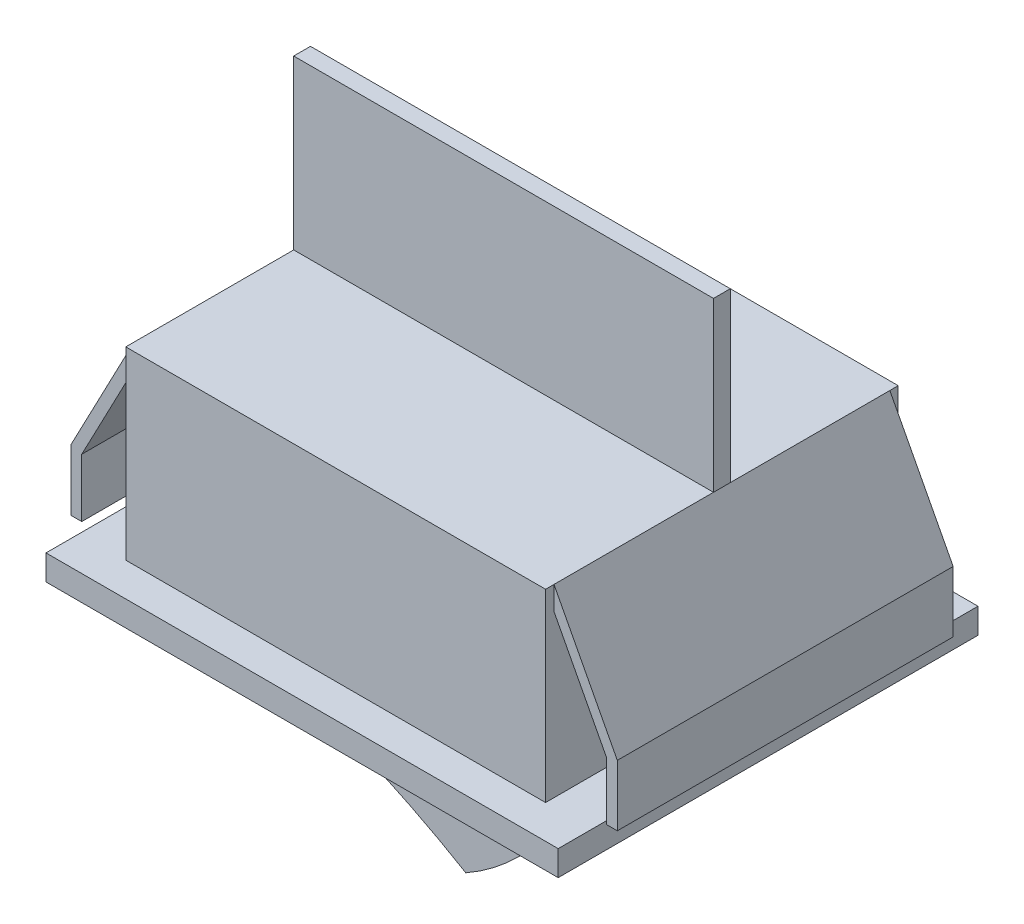
ISO-10303-21;
HEADER;
FILE_DESCRIPTION(('STEP AP214'),'2;1');
FILE_NAME('part.step','',(''),(''),'','','');
FILE_SCHEMA(('AUTOMOTIVE_DESIGN { 1 0 10303 214 1 1 1 1 }'));
ENDSEC;
DATA;
#1=APPLICATION_CONTEXT('core data for automotive mechanical design processes');
#2=APPLICATION_PROTOCOL_DEFINITION('international standard','automotive_design',2000,#1);
#3=PRODUCT_CONTEXT('',#1,'mechanical');
#4=PRODUCT('Part','Part','',(#3));
#5=PRODUCT_RELATED_PRODUCT_CATEGORY('part','',(#4));
#6=PRODUCT_DEFINITION_FORMATION('','',#4);
#7=PRODUCT_DEFINITION_CONTEXT('part definition',#1,'design');
#8=PRODUCT_DEFINITION('design','',#6,#7);
#9=PRODUCT_DEFINITION_SHAPE('','',#8);
#10=(LENGTH_UNIT() NAMED_UNIT(*) SI_UNIT(.MILLI.,.METRE.));
#11=(NAMED_UNIT(*) PLANE_ANGLE_UNIT() SI_UNIT($,.RADIAN.));
#12=(NAMED_UNIT(*) SI_UNIT($,.STERADIAN.) SOLID_ANGLE_UNIT());
#13=UNCERTAINTY_MEASURE_WITH_UNIT(LENGTH_MEASURE(1.E-05),#10,'distance_accuracy_value','');
#14=(GEOMETRIC_REPRESENTATION_CONTEXT(3) GLOBAL_UNCERTAINTY_ASSIGNED_CONTEXT((#13)) GLOBAL_UNIT_ASSIGNED_CONTEXT((#10,
#11,#12)) REPRESENTATION_CONTEXT('',''));
#15=CARTESIAN_POINT('',(0.,0.,0.));
#16=DIRECTION('',(0.,0.,1.));
#17=DIRECTION('',(1.,0.,0.));
#18=AXIS2_PLACEMENT_3D('',#15,#16,#17);
#19=CARTESIAN_POINT('',(12.5,11.,-10.5));
#20=DIRECTION('',(-1.,0.,0.));
#21=DIRECTION('',(0.,0.,1.));
#22=AXIS2_PLACEMENT_3D('',#19,#20,#21);
#23=PLANE('',#22);
#24=DIRECTION('',(0.,0.,1.));
#25=VECTOR('',#24,1.);
#26=CARTESIAN_POINT('',(12.5,11.,-10.));
#27=LINE('',#26,#25);
#28=CARTESIAN_POINT('',(12.5,11.,-0.500000000000004));
#29=VERTEX_POINT('',#28);
#30=CARTESIAN_POINT('',(12.5,11.,0.5));
#31=VERTEX_POINT('',#30);
#32=EDGE_CURVE('E11',#29,#31,#27,.T.);
#33=ORIENTED_EDGE('',*,*,#32,.F.);
#34=DIRECTION('',(0.,-1.,0.));
#35=VECTOR('',#34,1.);
#36=CARTESIAN_POINT('',(12.5,21.,-0.5));
#37=LINE('',#36,#35);
#38=CARTESIAN_POINT('',(12.5,21.,-0.5));
#39=VERTEX_POINT('',#38);
#40=EDGE_CURVE('E384',#39,#29,#37,.T.);
#41=ORIENTED_EDGE('',*,*,#40,.F.);
#42=DIRECTION('',(0.,0.,-1.));
#43=VECTOR('',#42,1.);
#44=CARTESIAN_POINT('',(12.5,21.,-0.5));
#45=LINE('',#44,#43);
#46=CARTESIAN_POINT('',(12.5,21.,0.5));
#47=VERTEX_POINT('',#46);
#48=EDGE_CURVE('E373',#47,#39,#45,.T.);
#49=ORIENTED_EDGE('',*,*,#48,.F.);
#50=DIRECTION('',(0.,-1.,0.));
#51=VECTOR('',#50,1.);
#52=CARTESIAN_POINT('',(12.5,21.,0.5));
#53=LINE('',#52,#51);
#54=EDGE_CURVE('E387',#47,#31,#53,.T.);
#55=ORIENTED_EDGE('',*,*,#54,.T.);
#56=EDGE_LOOP('',(#33,#41,#49,#55));
#57=FACE_BOUND('',#56,.T.);
#58=ADVANCED_FACE('F43',(#57),#23,.F.);
#59=CARTESIAN_POINT('',(-12.5,11.,-10.5));
#60=DIRECTION('',(1.,0.,0.));
#61=DIRECTION('',(0.,0.,-1.));
#62=AXIS2_PLACEMENT_3D('',#59,#60,#61);
#63=PLANE('',#62);
#64=DIRECTION('',(0.,1.,0.));
#65=VECTOR('',#64,1.);
#66=CARTESIAN_POINT('',(-12.5,9.6009161824891,10.));
#67=LINE('',#66,#65);
#68=CARTESIAN_POINT('',(-12.5,9.6009161824891,10.));
#69=VERTEX_POINT('',#68);
#70=CARTESIAN_POINT('',(-12.5,11.,10.));
#71=VERTEX_POINT('',#70);
#72=EDGE_CURVE('E310',#69,#71,#67,.T.);
#73=ORIENTED_EDGE('',*,*,#72,.F.);
#74=DIRECTION('',(0.,0.,1.));
#75=VECTOR('',#74,1.);
#76=CARTESIAN_POINT('',(-12.5,9.6009161824891,-10.));
#77=LINE('',#76,#75);
#78=CARTESIAN_POINT('',(-12.5,9.6009161824891,-10.));
#79=VERTEX_POINT('',#78);
#80=EDGE_CURVE('E354',#79,#69,#77,.T.);
#81=ORIENTED_EDGE('',*,*,#80,.F.);
#82=DIRECTION('',(0.,1.,0.));
#83=VECTOR('',#82,1.);
#84=CARTESIAN_POINT('',(-12.5,9.6009161824891,-10.));
#85=LINE('',#84,#83);
#86=CARTESIAN_POINT('',(-12.5,11.,-10.));
#87=VERTEX_POINT('',#86);
#88=EDGE_CURVE('E335',#79,#87,#85,.T.);
#89=ORIENTED_EDGE('',*,*,#88,.T.);
#90=DIRECTION('',(0.,0.,1.));
#91=VECTOR('',#90,1.);
#92=CARTESIAN_POINT('',(-12.5,11.,-10.5));
#93=LINE('',#92,#91);
#94=CARTESIAN_POINT('',(-12.5,11.,-10.5));
#95=VERTEX_POINT('',#94);
#96=EDGE_CURVE('E394',#95,#87,#93,.T.);
#97=ORIENTED_EDGE('',*,*,#96,.F.);
#98=DIRECTION('',(0.,-1.,0.));
#99=VECTOR('',#98,1.);
#100=CARTESIAN_POINT('',(-12.5,11.,-10.5));
#101=LINE('',#100,#99);
#102=CARTESIAN_POINT('',(-12.5,0.,-10.5));
#103=VERTEX_POINT('',#102);
#104=EDGE_CURVE('E409',#95,#103,#101,.T.);
#105=ORIENTED_EDGE('',*,*,#104,.T.);
#106=DIRECTION('',(0.,0.,1.));
#107=VECTOR('',#106,1.);
#108=CARTESIAN_POINT('',(-12.5,0.,-10.5));
#109=LINE('',#108,#107);
#110=CARTESIAN_POINT('',(-12.5,0.,10.5));
#111=VERTEX_POINT('',#110);
#112=EDGE_CURVE('E393',#103,#111,#109,.T.);
#113=ORIENTED_EDGE('',*,*,#112,.T.);
#114=DIRECTION('',(0.,-1.,0.));
#115=VECTOR('',#114,1.);
#116=CARTESIAN_POINT('',(-12.5,11.,10.5));
#117=LINE('',#116,#115);
#118=CARTESIAN_POINT('',(-12.5,11.,10.5));
#119=VERTEX_POINT('',#118);
#120=EDGE_CURVE('E47',#119,#111,#117,.T.);
#121=ORIENTED_EDGE('',*,*,#120,.F.);
#122=EDGE_CURVE('E399',#71,#119,#93,.T.);
#123=ORIENTED_EDGE('',*,*,#122,.F.);
#124=EDGE_LOOP('',(#73,#81,#89,#97,#105,#113,#121,#123));
#125=FACE_BOUND('',#124,.T.);
#126=ADVANCED_FACE('F465',(#125),#63,.F.);
#127=CARTESIAN_POINT('',(0.,11.,0.));
#128=DIRECTION('',(0.,-1.,0.));
#129=DIRECTION('',(0.,0.,-1.));
#130=AXIS2_PLACEMENT_3D('',#127,#128,#129);
#131=PLANE('',#130);
#132=DIRECTION('',(-1.,0.,0.));
#133=VECTOR('',#132,1.);
#134=CARTESIAN_POINT('',(12.5,11.,-0.5));
#135=LINE('',#134,#133);
#136=CARTESIAN_POINT('',(-12.5,11.,-0.5));
#137=VERTEX_POINT('',#136);
#138=EDGE_CURVE('E371',#29,#137,#135,.T.);
#139=ORIENTED_EDGE('',*,*,#138,.F.);
#140=DIRECTION('',(0.,0.,-1.));
#141=VECTOR('',#140,1.);
#142=CARTESIAN_POINT('',(12.5,11.,-10.5));
#143=LINE('',#142,#141);
#144=CARTESIAN_POINT('',(12.5,11.,-10.));
#145=VERTEX_POINT('',#144);
#146=EDGE_CURVE('E407',#29,#145,#143,.T.);
#147=ORIENTED_EDGE('',*,*,#146,.T.);
#148=CARTESIAN_POINT('',(12.5,11.,-10.5));
#149=VERTEX_POINT('',#148);
#150=EDGE_CURVE('E401',#145,#149,#143,.T.);
#151=ORIENTED_EDGE('',*,*,#150,.T.);
#152=DIRECTION('',(-1.,0.,0.));
#153=VECTOR('',#152,1.);
#154=CARTESIAN_POINT('',(12.5,11.,-10.5));
#155=LINE('',#154,#153);
#156=EDGE_CURVE('E405',#149,#95,#155,.T.);
#157=ORIENTED_EDGE('',*,*,#156,.T.);
#158=ORIENTED_EDGE('',*,*,#96,.T.);
#159=DIRECTION('',(0.,0.,1.));
#160=VECTOR('',#159,1.);
#161=CARTESIAN_POINT('',(-12.5,11.,-10.));
#162=LINE('',#161,#160);
#163=EDGE_CURVE('E353',#87,#137,#162,.T.);
#164=ORIENTED_EDGE('',*,*,#163,.T.);
#165=EDGE_LOOP('',(#139,#147,#151,#157,#158,#164));
#166=FACE_BOUND('',#165,.T.);
#167=ADVANCED_FACE('F458',(#166),#131,.F.);
#168=DIRECTION('',(1.,0.,0.));
#169=VECTOR('',#168,1.);
#170=CARTESIAN_POINT('',(12.5,11.,0.5));
#171=LINE('',#170,#169);
#172=CARTESIAN_POINT('',(-12.5,11.,0.499999999999997));
#173=VERTEX_POINT('',#172);
#174=EDGE_CURVE('E356',#173,#31,#171,.T.);
#175=ORIENTED_EDGE('',*,*,#174,.F.);
#176=EDGE_CURVE('E398',#173,#71,#93,.T.);
#177=ORIENTED_EDGE('',*,*,#176,.T.);
#178=ORIENTED_EDGE('',*,*,#122,.T.);
#179=DIRECTION('',(1.,0.,0.));
#180=VECTOR('',#179,1.);
#181=CARTESIAN_POINT('',(12.5,11.,10.5));
#182=LINE('',#181,#180);
#183=CARTESIAN_POINT('',(12.5,11.,10.5));
#184=VERTEX_POINT('',#183);
#185=EDGE_CURVE('E397',#119,#184,#182,.T.);
#186=ORIENTED_EDGE('',*,*,#185,.T.);
#187=CARTESIAN_POINT('',(12.5,11.,9.99999999999999));
#188=VERTEX_POINT('',#187);
#189=EDGE_CURVE('E402',#184,#188,#143,.T.);
#190=ORIENTED_EDGE('',*,*,#189,.T.);
#191=EDGE_CURVE('E406',#188,#31,#143,.T.);
#192=ORIENTED_EDGE('',*,*,#191,.T.);
#193=EDGE_LOOP('',(#175,#177,#178,#186,#190,#192));
#194=FACE_BOUND('',#193,.T.);
#195=ADVANCED_FACE('F443',(#194),#131,.F.);
#196=DIRECTION('',(0.,-1.,0.));
#197=VECTOR('',#196,1.);
#198=CARTESIAN_POINT('',(-12.5,21.,-0.5));
#199=LINE('',#198,#197);
#200=CARTESIAN_POINT('',(-12.5,21.,-0.5));
#201=VERTEX_POINT('',#200);
#202=EDGE_CURVE('E377',#201,#137,#199,.T.);
#203=ORIENTED_EDGE('',*,*,#202,.T.);
#204=EDGE_CURVE('E52',#137,#173,#162,.T.);
#205=ORIENTED_EDGE('',*,*,#204,.T.);
#206=DIRECTION('',(0.,-1.,0.));
#207=VECTOR('',#206,1.);
#208=CARTESIAN_POINT('',(-12.5,21.,0.5));
#209=LINE('',#208,#207);
#210=CARTESIAN_POINT('',(-12.5,21.,0.5));
#211=VERTEX_POINT('',#210);
#212=EDGE_CURVE('E390',#211,#173,#209,.T.);
#213=ORIENTED_EDGE('',*,*,#212,.F.);
#214=DIRECTION('',(0.,0.,1.));
#215=VECTOR('',#214,1.);
#216=CARTESIAN_POINT('',(-12.5,21.,-0.5));
#217=LINE('',#216,#215);
#218=EDGE_CURVE('E367',#201,#211,#217,.T.);
#219=ORIENTED_EDGE('',*,*,#218,.F.);
#220=EDGE_LOOP('',(#203,#205,#213,#219));
#221=FACE_BOUND('',#220,.T.);
#222=ADVANCED_FACE('F45',(#221),#63,.F.);
#223=CARTESIAN_POINT('',(12.5,11.,10.5));
#224=DIRECTION('',(0.,0.,-1.));
#225=DIRECTION('',(-1.,0.,0.));
#226=AXIS2_PLACEMENT_3D('',#223,#224,#225);
#227=PLANE('',#226);
#228=DIRECTION('',(1.,0.,0.));
#229=VECTOR('',#228,1.);
#230=CARTESIAN_POINT('',(12.5,0.,10.5));
#231=LINE('',#230,#229);
#232=CARTESIAN_POINT('',(12.5,0.,10.5));
#233=VERTEX_POINT('',#232);
#234=EDGE_CURVE('E412',#111,#233,#231,.T.);
#235=ORIENTED_EDGE('',*,*,#234,.T.);
#236=DIRECTION('',(0.,-1.,0.));
#237=VECTOR('',#236,1.);
#238=CARTESIAN_POINT('',(12.5,11.,10.5));
#239=LINE('',#238,#237);
#240=EDGE_CURVE('E425',#184,#233,#239,.T.);
#241=ORIENTED_EDGE('',*,*,#240,.F.);
#242=ORIENTED_EDGE('',*,*,#185,.F.);
#243=ORIENTED_EDGE('',*,*,#120,.T.);
#244=EDGE_LOOP('',(#235,#241,#242,#243));
#245=FACE_BOUND('',#244,.T.);
#246=ADVANCED_FACE('F487',(#245),#227,.F.);
#247=DIRECTION('',(0.,0.,1.));
#248=VECTOR('',#247,1.);
#249=CARTESIAN_POINT('',(12.5,9.6009161824891,-10.));
#250=LINE('',#249,#248);
#251=CARTESIAN_POINT('',(12.5,9.6009161824891,-10.));
#252=VERTEX_POINT('',#251);
#253=CARTESIAN_POINT('',(12.5,9.6009161824891,10.));
#254=VERTEX_POINT('',#253);
#255=EDGE_CURVE('E68',#252,#254,#250,.T.);
#256=ORIENTED_EDGE('',*,*,#255,.T.);
#257=DIRECTION('',(0.,1.,0.));
#258=VECTOR('',#257,1.);
#259=CARTESIAN_POINT('',(12.5,9.6009161824891,10.));
#260=LINE('',#259,#258);
#261=EDGE_CURVE('E277',#254,#188,#260,.T.);
#262=ORIENTED_EDGE('',*,*,#261,.T.);
#263=ORIENTED_EDGE('',*,*,#189,.F.);
#264=ORIENTED_EDGE('',*,*,#240,.T.);
#265=DIRECTION('',(0.,0.,-1.));
#266=VECTOR('',#265,1.);
#267=CARTESIAN_POINT('',(12.5,0.,-10.5));
#268=LINE('',#267,#266);
#269=CARTESIAN_POINT('',(12.5,0.,-10.5));
#270=VERTEX_POINT('',#269);
#271=EDGE_CURVE('E415',#233,#270,#268,.T.);
#272=ORIENTED_EDGE('',*,*,#271,.T.);
#273=DIRECTION('',(0.,-1.,0.));
#274=VECTOR('',#273,1.);
#275=CARTESIAN_POINT('',(12.5,11.,-10.5));
#276=LINE('',#275,#274);
#277=EDGE_CURVE('E423',#149,#270,#276,.T.);
#278=ORIENTED_EDGE('',*,*,#277,.F.);
#279=ORIENTED_EDGE('',*,*,#150,.F.);
#280=DIRECTION('',(0.,1.,0.));
#281=VECTOR('',#280,1.);
#282=CARTESIAN_POINT('',(12.5,9.6009161824891,-10.));
#283=LINE('',#282,#281);
#284=EDGE_CURVE('E294',#252,#145,#283,.T.);
#285=ORIENTED_EDGE('',*,*,#284,.F.);
#286=EDGE_LOOP('',(#256,#262,#263,#264,#272,#278,#279,#285));
#287=FACE_BOUND('',#286,.T.);
#288=ADVANCED_FACE('F495',(#287),#23,.F.);
#289=CARTESIAN_POINT('',(12.5,11.,-10.5));
#290=DIRECTION('',(0.,0.,1.));
#291=DIRECTION('',(1.,0.,0.));
#292=AXIS2_PLACEMENT_3D('',#289,#290,#291);
#293=PLANE('',#292);
#294=DIRECTION('',(-1.,0.,0.));
#295=VECTOR('',#294,1.);
#296=CARTESIAN_POINT('',(12.5,0.,-10.5));
#297=LINE('',#296,#295);
#298=EDGE_CURVE('E418',#270,#103,#297,.T.);
#299=ORIENTED_EDGE('',*,*,#298,.T.);
#300=ORIENTED_EDGE('',*,*,#104,.F.);
#301=ORIENTED_EDGE('',*,*,#156,.F.);
#302=ORIENTED_EDGE('',*,*,#277,.T.);
#303=EDGE_LOOP('',(#299,#300,#301,#302));
#304=FACE_BOUND('',#303,.T.);
#305=ADVANCED_FACE('F492',(#304),#293,.F.);
#306=CARTESIAN_POINT('',(12.5,21.,0.5));
#307=DIRECTION('',(0.,0.,-1.));
#308=DIRECTION('',(-1.,0.,0.));
#309=AXIS2_PLACEMENT_3D('',#306,#307,#308);
#310=PLANE('',#309);
#311=ORIENTED_EDGE('',*,*,#174,.T.);
#312=ORIENTED_EDGE('',*,*,#54,.F.);
#313=DIRECTION('',(1.,0.,0.));
#314=VECTOR('',#313,1.);
#315=CARTESIAN_POINT('',(12.5,21.,0.5));
#316=LINE('',#315,#314);
#317=EDGE_CURVE('E370',#211,#47,#316,.T.);
#318=ORIENTED_EDGE('',*,*,#317,.F.);
#319=ORIENTED_EDGE('',*,*,#212,.T.);
#320=EDGE_LOOP('',(#311,#312,#318,#319));
#321=FACE_BOUND('',#320,.T.);
#322=ADVANCED_FACE('F447',(#321),#310,.F.);
#323=CARTESIAN_POINT('',(12.5,21.,-0.5));
#324=DIRECTION('',(0.,0.,1.));
#325=DIRECTION('',(1.,0.,0.));
#326=AXIS2_PLACEMENT_3D('',#323,#324,#325);
#327=PLANE('',#326);
#328=ORIENTED_EDGE('',*,*,#138,.T.);
#329=ORIENTED_EDGE('',*,*,#202,.F.);
#330=DIRECTION('',(-1.,0.,0.));
#331=VECTOR('',#330,1.);
#332=CARTESIAN_POINT('',(12.5,21.,-0.5));
#333=LINE('',#332,#331);
#334=EDGE_CURVE('E375',#39,#201,#333,.T.);
#335=ORIENTED_EDGE('',*,*,#334,.F.);
#336=ORIENTED_EDGE('',*,*,#40,.T.);
#337=EDGE_LOOP('',(#328,#329,#335,#336));
#338=FACE_BOUND('',#337,.T.);
#339=ADVANCED_FACE('F454',(#338),#327,.F.);
#340=CARTESIAN_POINT('',(0.,21.,0.));
#341=DIRECTION('',(0.,-1.,0.));
#342=DIRECTION('',(0.,0.,-1.));
#343=AXIS2_PLACEMENT_3D('',#340,#341,#342);
#344=PLANE('',#343);
#345=ORIENTED_EDGE('',*,*,#218,.T.);
#346=ORIENTED_EDGE('',*,*,#317,.T.);
#347=ORIENTED_EDGE('',*,*,#48,.T.);
#348=ORIENTED_EDGE('',*,*,#334,.T.);
#349=EDGE_LOOP('',(#345,#346,#347,#348));
#350=FACE_BOUND('',#349,.T.);
#351=ADVANCED_FACE('F450',(#350),#344,.F.);
#352=CARTESIAN_POINT('',(-15.6214209350957,3.65136710304997,-10.));
#353=DIRECTION('',(0.88552603850104,-0.464589749280648,0.));
#354=DIRECTION('',(0.464589749280648,0.88552603850104,0.));
#355=AXIS2_PLACEMENT_3D('',#352,#353,#354);
#356=PLANE('',#355);
#357=ORIENTED_EDGE('',*,*,#80,.T.);
#358=DIRECTION('',(0.464589749280648,0.88552603850104,0.));
#359=VECTOR('',#358,1.);
#360=CARTESIAN_POINT('',(-15.6214209350957,3.65136710304997,10.));
#361=LINE('',#360,#359);
#362=CARTESIAN_POINT('',(-15.6214209350957,3.65136710304997,10.));
#363=VERTEX_POINT('',#362);
#364=EDGE_CURVE('E332',#363,#69,#361,.T.);
#365=ORIENTED_EDGE('',*,*,#364,.F.);
#366=DIRECTION('',(0.,0.,1.));
#367=VECTOR('',#366,1.);
#368=CARTESIAN_POINT('',(-15.6214209350957,3.65136710304997,-10.));
#369=LINE('',#368,#367);
#370=CARTESIAN_POINT('',(-15.6214209350957,3.65136710304997,-10.));
#371=VERTEX_POINT('',#370);
#372=EDGE_CURVE('E357',#371,#363,#369,.T.);
#373=ORIENTED_EDGE('',*,*,#372,.F.);
#374=DIRECTION('',(0.464589749280648,0.88552603850104,0.));
#375=VECTOR('',#374,1.);
#376=CARTESIAN_POINT('',(-15.6214209350957,3.65136710304997,-10.));
#377=LINE('',#376,#375);
#378=EDGE_CURVE('E350',#371,#79,#377,.T.);
#379=ORIENTED_EDGE('',*,*,#378,.T.);
#380=EDGE_LOOP('',(#357,#365,#373,#379));
#381=FACE_BOUND('',#380,.T.);
#382=ADVANCED_FACE('F472',(#381),#356,.T.);
#383=CARTESIAN_POINT('',(-15.6214209350957,0.178717711958706,-10.));
#384=DIRECTION('',(1.,0.,0.));
#385=DIRECTION('',(0.,0.,-1.));
#386=AXIS2_PLACEMENT_3D('',#383,#384,#385);
#387=PLANE('',#386);
#388=ORIENTED_EDGE('',*,*,#372,.T.);
#389=DIRECTION('',(0.,1.,0.));
#390=VECTOR('',#389,1.);
#391=CARTESIAN_POINT('',(-15.6214209350957,0.178717711958706,10.));
#392=LINE('',#391,#390);
#393=CARTESIAN_POINT('',(-15.6214209350957,0.178717711958706,10.));
#394=VERTEX_POINT('',#393);
#395=EDGE_CURVE('E329',#394,#363,#392,.T.);
#396=ORIENTED_EDGE('',*,*,#395,.F.);
#397=DIRECTION('',(0.,0.,1.));
#398=VECTOR('',#397,1.);
#399=CARTESIAN_POINT('',(-15.6214209350957,0.178717711958706,-10.));
#400=LINE('',#399,#398);
#401=CARTESIAN_POINT('',(-15.6214209350957,0.178717711958706,-10.));
#402=VERTEX_POINT('',#401);
#403=EDGE_CURVE('E359',#402,#394,#400,.T.);
#404=ORIENTED_EDGE('',*,*,#403,.F.);
#405=DIRECTION('',(0.,1.,0.));
#406=VECTOR('',#405,1.);
#407=CARTESIAN_POINT('',(-15.6214209350957,0.178717711958706,-10.));
#408=LINE('',#407,#406);
#409=EDGE_CURVE('E347',#402,#371,#408,.T.);
#410=ORIENTED_EDGE('',*,*,#409,.T.);
#411=EDGE_LOOP('',(#388,#396,#404,#410));
#412=FACE_BOUND('',#411,.T.);
#413=ADVANCED_FACE('F476',(#412),#387,.T.);
#414=CARTESIAN_POINT('',(-16.2714209350957,0.178717711958706,-10.));
#415=DIRECTION('',(0.,-1.,0.));
#416=DIRECTION('',(0.,0.,-1.));
#417=AXIS2_PLACEMENT_3D('',#414,#415,#416);
#418=PLANE('',#417);
#419=ORIENTED_EDGE('',*,*,#403,.T.);
#420=DIRECTION('',(1.,0.,0.));
#421=VECTOR('',#420,1.);
#422=CARTESIAN_POINT('',(-16.2714209350957,0.178717711958706,10.));
#423=LINE('',#422,#421);
#424=CARTESIAN_POINT('',(-16.2714209350957,0.178717711958706,10.));
#425=VERTEX_POINT('',#424);
#426=EDGE_CURVE('E326',#425,#394,#423,.T.);
#427=ORIENTED_EDGE('',*,*,#426,.F.);
#428=DIRECTION('',(0.,0.,1.));
#429=VECTOR('',#428,1.);
#430=CARTESIAN_POINT('',(-16.2714209350957,0.178717711958706,-10.));
#431=LINE('',#430,#429);
#432=CARTESIAN_POINT('',(-16.2714209350957,0.178717711958706,-10.));
#433=VERTEX_POINT('',#432);
#434=EDGE_CURVE('E361',#433,#425,#431,.T.);
#435=ORIENTED_EDGE('',*,*,#434,.F.);
#436=DIRECTION('',(1.,0.,0.));
#437=VECTOR('',#436,1.);
#438=CARTESIAN_POINT('',(-16.2714209350957,0.178717711958706,-10.));
#439=LINE('',#438,#437);
#440=EDGE_CURVE('E344',#433,#402,#439,.T.);
#441=ORIENTED_EDGE('',*,*,#440,.T.);
#442=EDGE_LOOP('',(#419,#427,#435,#441));
#443=FACE_BOUND('',#442,.T.);
#444=ADVANCED_FACE('F479',(#443),#418,.T.);
#445=CARTESIAN_POINT('',(-16.2714209350957,3.81152577010953,-10.));
#446=DIRECTION('',(-1.,0.,0.));
#447=DIRECTION('',(0.,0.,1.));
#448=AXIS2_PLACEMENT_3D('',#445,#446,#447);
#449=PLANE('',#448);
#450=ORIENTED_EDGE('',*,*,#434,.T.);
#451=DIRECTION('',(0.,-1.,0.));
#452=VECTOR('',#451,1.);
#453=CARTESIAN_POINT('',(-16.2714209350957,3.81152577010953,10.));
#454=LINE('',#453,#452);
#455=CARTESIAN_POINT('',(-16.2714209350957,3.81152577010953,10.));
#456=VERTEX_POINT('',#455);
#457=EDGE_CURVE('E323',#456,#425,#454,.T.);
#458=ORIENTED_EDGE('',*,*,#457,.F.);
#459=DIRECTION('',(0.,0.,1.));
#460=VECTOR('',#459,1.);
#461=CARTESIAN_POINT('',(-16.2714209350957,3.81152577010953,-10.));
#462=LINE('',#461,#460);
#463=CARTESIAN_POINT('',(-16.2714209350957,3.81152577010953,-10.));
#464=VERTEX_POINT('',#463);
#465=EDGE_CURVE('E363',#464,#456,#462,.T.);
#466=ORIENTED_EDGE('',*,*,#465,.F.);
#467=DIRECTION('',(0.,-1.,0.));
#468=VECTOR('',#467,1.);
#469=CARTESIAN_POINT('',(-16.2714209350957,3.81152577010953,-10.));
#470=LINE('',#469,#468);
#471=EDGE_CURVE('E341',#464,#433,#470,.T.);
#472=ORIENTED_EDGE('',*,*,#471,.T.);
#473=EDGE_LOOP('',(#450,#458,#466,#472));
#474=FACE_BOUND('',#473,.T.);
#475=ADVANCED_FACE('F483',(#474),#449,.T.);
#476=CARTESIAN_POINT('',(-12.5,11.,-10.));
#477=DIRECTION('',(-0.88552603850104,0.464589749280648,0.));
#478=DIRECTION('',(-0.464589749280648,-0.88552603850104,0.));
#479=AXIS2_PLACEMENT_3D('',#476,#477,#478);
#480=PLANE('',#479);
#481=ORIENTED_EDGE('',*,*,#465,.T.);
#482=DIRECTION('',(-0.464589749280648,-0.88552603850104,0.));
#483=VECTOR('',#482,1.);
#484=CARTESIAN_POINT('',(-12.5,11.,10.));
#485=LINE('',#484,#483);
#486=EDGE_CURVE('E320',#71,#456,#485,.T.);
#487=ORIENTED_EDGE('',*,*,#486,.F.);
#488=ORIENTED_EDGE('',*,*,#176,.F.);
#489=ORIENTED_EDGE('',*,*,#204,.F.);
#490=ORIENTED_EDGE('',*,*,#163,.F.);
#491=DIRECTION('',(-0.464589749280648,-0.88552603850104,0.));
#492=VECTOR('',#491,1.);
#493=CARTESIAN_POINT('',(-12.5,11.,-10.));
#494=LINE('',#493,#492);
#495=EDGE_CURVE('E338',#87,#464,#494,.T.);
#496=ORIENTED_EDGE('',*,*,#495,.T.);
#497=EDGE_LOOP('',(#481,#487,#488,#489,#490,#496));
#498=FACE_BOUND('',#497,.T.);
#499=ADVANCED_FACE('F461',(#498),#480,.T.);
#500=CARTESIAN_POINT('',(0.,0.,-10.));
#501=DIRECTION('',(0.,0.,-1.));
#502=DIRECTION('',(-1.,0.,0.));
#503=AXIS2_PLACEMENT_3D('',#500,#501,#502);
#504=PLANE('',#503);
#505=ORIENTED_EDGE('',*,*,#88,.F.);
#506=ORIENTED_EDGE('',*,*,#378,.F.);
#507=ORIENTED_EDGE('',*,*,#409,.F.);
#508=ORIENTED_EDGE('',*,*,#440,.F.);
#509=ORIENTED_EDGE('',*,*,#471,.F.);
#510=ORIENTED_EDGE('',*,*,#495,.F.);
#511=EDGE_LOOP('',(#505,#506,#507,#508,#509,#510));
#512=FACE_BOUND('',#511,.T.);
#513=ADVANCED_FACE('F468',(#512),#504,.T.);
#514=CARTESIAN_POINT('',(0.,0.,10.));
#515=DIRECTION('',(0.,0.,-1.));
#516=DIRECTION('',(-1.,0.,0.));
#517=AXIS2_PLACEMENT_3D('',#514,#515,#516);
#518=PLANE('',#517);
#519=ORIENTED_EDGE('',*,*,#72,.T.);
#520=ORIENTED_EDGE('',*,*,#486,.T.);
#521=ORIENTED_EDGE('',*,*,#457,.T.);
#522=ORIENTED_EDGE('',*,*,#426,.T.);
#523=ORIENTED_EDGE('',*,*,#395,.T.);
#524=ORIENTED_EDGE('',*,*,#364,.T.);
#525=EDGE_LOOP('',(#519,#520,#521,#522,#523,#524));
#526=FACE_BOUND('',#525,.T.);
#527=ADVANCED_FACE('F485',(#526),#518,.F.);
#528=CARTESIAN_POINT('',(12.5,11.,-10.));
#529=DIRECTION('',(-0.88552603850104,-0.464589749280648,0.));
#530=DIRECTION('',(0.464589749280648,-0.88552603850104,0.));
#531=AXIS2_PLACEMENT_3D('',#528,#529,#530);
#532=PLANE('',#531);
#533=ORIENTED_EDGE('',*,*,#146,.F.);
#534=ORIENTED_EDGE('',*,*,#32,.T.);
#535=ORIENTED_EDGE('',*,*,#191,.F.);
#536=DIRECTION('',(0.464589749280648,-0.88552603850104,0.));
#537=VECTOR('',#536,1.);
#538=CARTESIAN_POINT('',(12.5,11.,10.));
#539=LINE('',#538,#537);
#540=CARTESIAN_POINT('',(16.2714209350957,3.81152577010953,10.));
#541=VERTEX_POINT('',#540);
#542=EDGE_CURVE('E291',#188,#541,#539,.T.);
#543=ORIENTED_EDGE('',*,*,#542,.T.);
#544=DIRECTION('',(0.,0.,1.));
#545=VECTOR('',#544,1.);
#546=CARTESIAN_POINT('',(16.2714209350957,3.81152577010953,-10.));
#547=LINE('',#546,#545);
#548=CARTESIAN_POINT('',(16.2714209350957,3.81152577010953,-10.));
#549=VERTEX_POINT('',#548);
#550=EDGE_CURVE('E308',#549,#541,#547,.T.);
#551=ORIENTED_EDGE('',*,*,#550,.F.);
#552=DIRECTION('',(0.464589749280648,-0.88552603850104,0.));
#553=VECTOR('',#552,1.);
#554=CARTESIAN_POINT('',(12.5,11.,-10.));
#555=LINE('',#554,#553);
#556=EDGE_CURVE('E306',#145,#549,#555,.T.);
#557=ORIENTED_EDGE('',*,*,#556,.F.);
#558=EDGE_LOOP('',(#533,#534,#535,#543,#551,#557));
#559=FACE_BOUND('',#558,.T.);
#560=ADVANCED_FACE('F499',(#559),#532,.F.);
#561=CARTESIAN_POINT('',(16.2714209350957,3.81152577010953,-10.));
#562=DIRECTION('',(-1.,0.,0.));
#563=DIRECTION('',(0.,0.,1.));
#564=AXIS2_PLACEMENT_3D('',#561,#562,#563);
#565=PLANE('',#564);
#566=ORIENTED_EDGE('',*,*,#550,.T.);
#567=DIRECTION('',(0.,-1.,0.));
#568=VECTOR('',#567,1.);
#569=CARTESIAN_POINT('',(16.2714209350957,3.81152577010953,10.));
#570=LINE('',#569,#568);
#571=CARTESIAN_POINT('',(16.2714209350957,0.178717711958706,10.));
#572=VERTEX_POINT('',#571);
#573=EDGE_CURVE('E288',#541,#572,#570,.T.);
#574=ORIENTED_EDGE('',*,*,#573,.T.);
#575=DIRECTION('',(0.,0.,1.));
#576=VECTOR('',#575,1.);
#577=CARTESIAN_POINT('',(16.2714209350957,0.178717711958706,-10.));
#578=LINE('',#577,#576);
#579=CARTESIAN_POINT('',(16.2714209350957,0.178717711958706,-10.));
#580=VERTEX_POINT('',#579);
#581=EDGE_CURVE('E311',#580,#572,#578,.T.);
#582=ORIENTED_EDGE('',*,*,#581,.F.);
#583=DIRECTION('',(0.,-1.,0.));
#584=VECTOR('',#583,1.);
#585=CARTESIAN_POINT('',(16.2714209350957,3.81152577010953,-10.));
#586=LINE('',#585,#584);
#587=EDGE_CURVE('E304',#549,#580,#586,.T.);
#588=ORIENTED_EDGE('',*,*,#587,.F.);
#589=EDGE_LOOP('',(#566,#574,#582,#588));
#590=FACE_BOUND('',#589,.T.);
#591=ADVANCED_FACE('F523',(#590),#565,.F.);
#592=CARTESIAN_POINT('',(16.2714209350957,0.178717711958706,-10.));
#593=DIRECTION('',(0.,1.,0.));
#594=DIRECTION('',(0.,0.,1.));
#595=AXIS2_PLACEMENT_3D('',#592,#593,#594);
#596=PLANE('',#595);
#597=ORIENTED_EDGE('',*,*,#581,.T.);
#598=DIRECTION('',(-1.,0.,0.));
#599=VECTOR('',#598,1.);
#600=CARTESIAN_POINT('',(16.2714209350957,0.178717711958706,10.));
#601=LINE('',#600,#599);
#602=CARTESIAN_POINT('',(15.6214209350957,0.178717711958706,10.));
#603=VERTEX_POINT('',#602);
#604=EDGE_CURVE('E285',#572,#603,#601,.T.);
#605=ORIENTED_EDGE('',*,*,#604,.T.);
#606=DIRECTION('',(0.,0.,1.));
#607=VECTOR('',#606,1.);
#608=CARTESIAN_POINT('',(15.6214209350957,0.178717711958706,-10.));
#609=LINE('',#608,#607);
#610=CARTESIAN_POINT('',(15.6214209350957,0.178717711958706,-10.));
#611=VERTEX_POINT('',#610);
#612=EDGE_CURVE('E313',#611,#603,#609,.T.);
#613=ORIENTED_EDGE('',*,*,#612,.F.);
#614=DIRECTION('',(-1.,0.,0.));
#615=VECTOR('',#614,1.);
#616=CARTESIAN_POINT('',(16.2714209350957,0.178717711958706,-10.));
#617=LINE('',#616,#615);
#618=EDGE_CURVE('E302',#580,#611,#617,.T.);
#619=ORIENTED_EDGE('',*,*,#618,.F.);
#620=EDGE_LOOP('',(#597,#605,#613,#619));
#621=FACE_BOUND('',#620,.T.);
#622=ADVANCED_FACE('F519',(#621),#596,.F.);
#623=CARTESIAN_POINT('',(15.6214209350957,0.178717711958706,-10.));
#624=DIRECTION('',(1.,0.,0.));
#625=DIRECTION('',(0.,0.,-1.));
#626=AXIS2_PLACEMENT_3D('',#623,#624,#625);
#627=PLANE('',#626);
#628=ORIENTED_EDGE('',*,*,#612,.T.);
#629=DIRECTION('',(0.,1.,0.));
#630=VECTOR('',#629,1.);
#631=CARTESIAN_POINT('',(15.6214209350957,0.178717711958706,10.));
#632=LINE('',#631,#630);
#633=CARTESIAN_POINT('',(15.6214209350957,3.65136710304997,10.));
#634=VERTEX_POINT('',#633);
#635=EDGE_CURVE('E282',#603,#634,#632,.T.);
#636=ORIENTED_EDGE('',*,*,#635,.T.);
#637=DIRECTION('',(0.,0.,1.));
#638=VECTOR('',#637,1.);
#639=CARTESIAN_POINT('',(15.6214209350957,3.65136710304997,-10.));
#640=LINE('',#639,#638);
#641=CARTESIAN_POINT('',(15.6214209350957,3.65136710304997,-10.));
#642=VERTEX_POINT('',#641);
#643=EDGE_CURVE('E315',#642,#634,#640,.T.);
#644=ORIENTED_EDGE('',*,*,#643,.F.);
#645=DIRECTION('',(0.,1.,0.));
#646=VECTOR('',#645,1.);
#647=CARTESIAN_POINT('',(15.6214209350957,0.178717711958706,-10.));
#648=LINE('',#647,#646);
#649=EDGE_CURVE('E300',#611,#642,#648,.T.);
#650=ORIENTED_EDGE('',*,*,#649,.F.);
#651=EDGE_LOOP('',(#628,#636,#644,#650));
#652=FACE_BOUND('',#651,.T.);
#653=ADVANCED_FACE('F515',(#652),#627,.F.);
#654=CARTESIAN_POINT('',(15.6214209350957,3.65136710304997,-10.));
#655=DIRECTION('',(0.88552603850104,0.464589749280648,0.));
#656=DIRECTION('',(-0.464589749280648,0.88552603850104,0.));
#657=AXIS2_PLACEMENT_3D('',#654,#655,#656);
#658=PLANE('',#657);
#659=ORIENTED_EDGE('',*,*,#643,.T.);
#660=DIRECTION('',(-0.464589749280648,0.88552603850104,0.));
#661=VECTOR('',#660,1.);
#662=CARTESIAN_POINT('',(15.6214209350957,3.65136710304997,10.));
#663=LINE('',#662,#661);
#664=EDGE_CURVE('E279',#634,#254,#663,.T.);
#665=ORIENTED_EDGE('',*,*,#664,.T.);
#666=ORIENTED_EDGE('',*,*,#255,.F.);
#667=DIRECTION('',(-0.464589749280648,0.88552603850104,0.));
#668=VECTOR('',#667,1.);
#669=CARTESIAN_POINT('',(15.6214209350957,3.65136710304997,-10.));
#670=LINE('',#669,#668);
#671=EDGE_CURVE('E297',#642,#252,#670,.T.);
#672=ORIENTED_EDGE('',*,*,#671,.F.);
#673=EDGE_LOOP('',(#659,#665,#666,#672));
#674=FACE_BOUND('',#673,.T.);
#675=ADVANCED_FACE('F507',(#674),#658,.F.);
#676=CARTESIAN_POINT('',(0.,0.,-10.));
#677=DIRECTION('',(0.,0.,-1.));
#678=DIRECTION('',(1.,0.,0.));
#679=AXIS2_PLACEMENT_3D('',#676,#677,#678);
#680=PLANE('',#679);
#681=ORIENTED_EDGE('',*,*,#284,.T.);
#682=ORIENTED_EDGE('',*,*,#556,.T.);
#683=ORIENTED_EDGE('',*,*,#587,.T.);
#684=ORIENTED_EDGE('',*,*,#618,.T.);
#685=ORIENTED_EDGE('',*,*,#649,.T.);
#686=ORIENTED_EDGE('',*,*,#671,.T.);
#687=EDGE_LOOP('',(#681,#682,#683,#684,#685,#686));
#688=FACE_BOUND('',#687,.T.);
#689=ADVANCED_FACE('F502',(#688),#680,.T.);
#690=CARTESIAN_POINT('',(0.,0.,10.));
#691=DIRECTION('',(0.,0.,-1.));
#692=DIRECTION('',(1.,0.,0.));
#693=AXIS2_PLACEMENT_3D('',#690,#691,#692);
#694=PLANE('',#693);
#695=ORIENTED_EDGE('',*,*,#261,.F.);
#696=ORIENTED_EDGE('',*,*,#664,.F.);
#697=ORIENTED_EDGE('',*,*,#635,.F.);
#698=ORIENTED_EDGE('',*,*,#604,.F.);
#699=ORIENTED_EDGE('',*,*,#573,.F.);
#700=ORIENTED_EDGE('',*,*,#542,.F.);
#701=EDGE_LOOP('',(#695,#696,#697,#698,#699,#700));
#702=FACE_BOUND('',#701,.T.);
#703=ADVANCED_FACE('F511',(#702),#694,.F.);
#704=CARTESIAN_POINT('',(0.,0.,0.));
#705=DIRECTION('',(0.,1.,0.));
#706=DIRECTION('',(0.,0.,1.));
#707=AXIS2_PLACEMENT_3D('',#704,#705,#706);
#708=PLANE('',#707);
#709=DIRECTION('',(0.,0.,-1.));
#710=VECTOR('',#709,1.);
#711=CARTESIAN_POINT('',(-15.25,0.,12.5));
#712=LINE('',#711,#710);
#713=CARTESIAN_POINT('',(-15.25,0.,12.5));
#714=VERTEX_POINT('',#713);
#715=CARTESIAN_POINT('',(-15.25,0.,-12.5));
#716=VERTEX_POINT('',#715);
#717=EDGE_CURVE('E242',#714,#716,#712,.T.);
#718=ORIENTED_EDGE('',*,*,#717,.F.);
#719=DIRECTION('',(-1.,0.,0.));
#720=VECTOR('',#719,1.);
#721=CARTESIAN_POINT('',(15.25,0.,12.5));
#722=LINE('',#721,#720);
#723=CARTESIAN_POINT('',(15.25,0.,12.5));
#724=VERTEX_POINT('',#723);
#725=EDGE_CURVE('E255',#724,#714,#722,.T.);
#726=ORIENTED_EDGE('',*,*,#725,.F.);
#727=DIRECTION('',(0.,0.,1.));
#728=VECTOR('',#727,1.);
#729=CARTESIAN_POINT('',(15.25,0.,12.5));
#730=LINE('',#729,#728);
#731=CARTESIAN_POINT('',(15.25,0.,-12.5));
#732=VERTEX_POINT('',#731);
#733=EDGE_CURVE('E263',#732,#724,#730,.T.);
#734=ORIENTED_EDGE('',*,*,#733,.F.);
#735=DIRECTION('',(1.,0.,0.));
#736=VECTOR('',#735,1.);
#737=CARTESIAN_POINT('',(15.25,0.,-12.5));
#738=LINE('',#737,#736);
#739=EDGE_CURVE('E246',#716,#732,#738,.T.);
#740=ORIENTED_EDGE('',*,*,#739,.F.);
#741=EDGE_LOOP('',(#718,#726,#734,#740));
#742=FACE_BOUND('',#741,.T.);
#743=ORIENTED_EDGE('',*,*,#112,.F.);
#744=ORIENTED_EDGE('',*,*,#298,.F.);
#745=ORIENTED_EDGE('',*,*,#271,.F.);
#746=ORIENTED_EDGE('',*,*,#234,.F.);
#747=EDGE_LOOP('',(#743,#744,#745,#746));
#748=FACE_BOUND('',#747,.T.);
#749=ADVANCED_FACE('F490',(#742,#748),#708,.T.);
#750=CARTESIAN_POINT('',(-15.25,-1.5,12.5));
#751=DIRECTION('',(1.,0.,0.));
#752=DIRECTION('',(0.,0.,-1.));
#753=AXIS2_PLACEMENT_3D('',#750,#751,#752);
#754=PLANE('',#753);
#755=ORIENTED_EDGE('',*,*,#717,.T.);
#756=DIRECTION('',(0.,1.,0.));
#757=VECTOR('',#756,1.);
#758=CARTESIAN_POINT('',(-15.25,-1.5,-12.5));
#759=LINE('',#758,#757);
#760=CARTESIAN_POINT('',(-15.25,-1.5,-12.5));
#761=VERTEX_POINT('',#760);
#762=EDGE_CURVE('E274',#761,#716,#759,.T.);
#763=ORIENTED_EDGE('',*,*,#762,.F.);
#764=DIRECTION('',(0.,0.,-1.));
#765=VECTOR('',#764,1.);
#766=CARTESIAN_POINT('',(-15.25,-1.5,12.5));
#767=LINE('',#766,#765);
#768=CARTESIAN_POINT('',(-15.25,-1.5,12.5));
#769=VERTEX_POINT('',#768);
#770=EDGE_CURVE('E251',#769,#761,#767,.T.);
#771=ORIENTED_EDGE('',*,*,#770,.F.);
#772=DIRECTION('',(0.,1.,0.));
#773=VECTOR('',#772,1.);
#774=CARTESIAN_POINT('',(-15.25,-1.5,12.5));
#775=LINE('',#774,#773);
#776=EDGE_CURVE('E260',#769,#714,#775,.T.);
#777=ORIENTED_EDGE('',*,*,#776,.T.);
#778=EDGE_LOOP('',(#755,#763,#771,#777));
#779=FACE_BOUND('',#778,.T.);
#780=ADVANCED_FACE('F604',(#779),#754,.F.);
#781=CARTESIAN_POINT('',(15.25,-1.5,-12.5));
#782=DIRECTION('',(0.,0.,1.));
#783=DIRECTION('',(1.,0.,0.));
#784=AXIS2_PLACEMENT_3D('',#781,#782,#783);
#785=PLANE('',#784);
#786=ORIENTED_EDGE('',*,*,#739,.T.);
#787=DIRECTION('',(0.,1.,0.));
#788=VECTOR('',#787,1.);
#789=CARTESIAN_POINT('',(15.25,-1.5,-12.5));
#790=LINE('',#789,#788);
#791=CARTESIAN_POINT('',(15.25,-1.5,-12.5));
#792=VERTEX_POINT('',#791);
#793=EDGE_CURVE('E271',#792,#732,#790,.T.);
#794=ORIENTED_EDGE('',*,*,#793,.F.);
#795=DIRECTION('',(1.,0.,0.));
#796=VECTOR('',#795,1.);
#797=CARTESIAN_POINT('',(15.25,-1.5,-12.5));
#798=LINE('',#797,#796);
#799=EDGE_CURVE('E254',#761,#792,#798,.T.);
#800=ORIENTED_EDGE('',*,*,#799,.F.);
#801=ORIENTED_EDGE('',*,*,#762,.T.);
#802=EDGE_LOOP('',(#786,#794,#800,#801));
#803=FACE_BOUND('',#802,.T.);
#804=ADVANCED_FACE('F612',(#803),#785,.F.);
#805=CARTESIAN_POINT('',(15.25,-1.5,12.5));
#806=DIRECTION('',(-1.,0.,0.));
#807=DIRECTION('',(0.,0.,1.));
#808=AXIS2_PLACEMENT_3D('',#805,#806,#807);
#809=PLANE('',#808);
#810=ORIENTED_EDGE('',*,*,#733,.T.);
#811=DIRECTION('',(0.,1.,0.));
#812=VECTOR('',#811,1.);
#813=CARTESIAN_POINT('',(15.25,-1.5,12.5));
#814=LINE('',#813,#812);
#815=CARTESIAN_POINT('',(15.25,-1.5,12.5));
#816=VERTEX_POINT('',#815);
#817=EDGE_CURVE('E268',#816,#724,#814,.T.);
#818=ORIENTED_EDGE('',*,*,#817,.F.);
#819=DIRECTION('',(0.,0.,1.));
#820=VECTOR('',#819,1.);
#821=CARTESIAN_POINT('',(15.25,-1.5,12.5));
#822=LINE('',#821,#820);
#823=EDGE_CURVE('E257',#792,#816,#822,.T.);
#824=ORIENTED_EDGE('',*,*,#823,.F.);
#825=ORIENTED_EDGE('',*,*,#793,.T.);
#826=EDGE_LOOP('',(#810,#818,#824,#825));
#827=FACE_BOUND('',#826,.T.);
#828=ADVANCED_FACE('F620',(#827),#809,.F.);
#829=CARTESIAN_POINT('',(15.25,-1.5,12.5));
#830=DIRECTION('',(0.,0.,-1.));
#831=DIRECTION('',(-1.,0.,0.));
#832=AXIS2_PLACEMENT_3D('',#829,#830,#831);
#833=PLANE('',#832);
#834=ORIENTED_EDGE('',*,*,#725,.T.);
#835=ORIENTED_EDGE('',*,*,#776,.F.);
#836=DIRECTION('',(-1.,0.,0.));
#837=VECTOR('',#836,1.);
#838=CARTESIAN_POINT('',(15.25,-1.5,12.5));
#839=LINE('',#838,#837);
#840=EDGE_CURVE('E259',#816,#769,#839,.T.);
#841=ORIENTED_EDGE('',*,*,#840,.F.);
#842=ORIENTED_EDGE('',*,*,#817,.T.);
#843=EDGE_LOOP('',(#834,#835,#841,#842));
#844=FACE_BOUND('',#843,.T.);
#845=ADVANCED_FACE('F628',(#844),#833,.F.);
#846=CARTESIAN_POINT('',(0.,-1.5,0.));
#847=DIRECTION('',(0.,1.,0.));
#848=DIRECTION('',(0.,0.,1.));
#849=AXIS2_PLACEMENT_3D('',#846,#847,#848);
#850=PLANE('',#849);
#851=DIRECTION('',(-1.,0.,0.));
#852=VECTOR('',#851,1.);
#853=CARTESIAN_POINT('',(11.75,-1.50000000000001,-8.5));
#854=LINE('',#853,#852);
#855=CARTESIAN_POINT('',(11.75,-1.50000000000001,-8.5));
#856=VERTEX_POINT('',#855);
#857=CARTESIAN_POINT('',(-11.75,-1.5,-8.5));
#858=VERTEX_POINT('',#857);
#859=EDGE_CURVE('E241',#856,#858,#854,.T.);
#860=ORIENTED_EDGE('',*,*,#859,.T.);
#861=DIRECTION('',(0.,0.,1.));
#862=VECTOR('',#861,1.);
#863=CARTESIAN_POINT('',(-11.75,-1.5,-8.5));
#864=LINE('',#863,#862);
#865=CARTESIAN_POINT('',(-11.75,-1.5,8.5));
#866=VERTEX_POINT('',#865);
#867=EDGE_CURVE('E60',#858,#866,#864,.T.);
#868=ORIENTED_EDGE('',*,*,#867,.T.);
#869=DIRECTION('',(-1.,0.,0.));
#870=VECTOR('',#869,1.);
#871=CARTESIAN_POINT('',(11.75,-1.50000000000001,8.5));
#872=LINE('',#871,#870);
#873=CARTESIAN_POINT('',(11.75,-1.50000000000001,8.5));
#874=VERTEX_POINT('',#873);
#875=EDGE_CURVE('E227',#874,#866,#872,.T.);
#876=ORIENTED_EDGE('',*,*,#875,.F.);
#877=DIRECTION('',(0.,0.,1.));
#878=VECTOR('',#877,1.);
#879=CARTESIAN_POINT('',(11.75,-1.50000000000001,-8.5));
#880=LINE('',#879,#878);
#881=EDGE_CURVE('E243',#856,#874,#880,.T.);
#882=ORIENTED_EDGE('',*,*,#881,.F.);
#883=EDGE_LOOP('',(#860,#868,#876,#882));
#884=FACE_BOUND('',#883,.T.);
#885=ORIENTED_EDGE('',*,*,#770,.T.);
#886=ORIENTED_EDGE('',*,*,#799,.T.);
#887=ORIENTED_EDGE('',*,*,#823,.T.);
#888=ORIENTED_EDGE('',*,*,#840,.T.);
#889=EDGE_LOOP('',(#885,#886,#887,#888));
#890=FACE_BOUND('',#889,.T.);
#891=ADVANCED_FACE('F239',(#884,#890),#850,.F.);
#892=CARTESIAN_POINT('',(-20.9024669844267,-52.9489495734566,-8.5));
#893=DIRECTION('',(0.,0.,1.));
#894=DIRECTION('',(1.,0.,0.));
#895=AXIS2_PLACEMENT_3D('',#892,#893,#894);
#896=CYLINDRICAL_SURFACE('',#895,52.256693964631);
#897=DIRECTION('',(0.,0.,1.));
#898=VECTOR('',#897,1.);
#899=CARTESIAN_POINT('',(5.75,-8.,-8.5));
#900=LINE('',#899,#898);
#901=CARTESIAN_POINT('',(5.75,-8.,-8.5));
#902=VERTEX_POINT('',#901);
#903=CARTESIAN_POINT('',(5.75,-8.,8.5));
#904=VERTEX_POINT('',#903);
#905=EDGE_CURVE('E236',#902,#904,#900,.T.);
#906=ORIENTED_EDGE('',*,*,#905,.T.);
#907=CARTESIAN_POINT('',(-20.9024669844267,-52.9489495734566,8.5));
#908=DIRECTION('',(0.,0.,1.));
#909=DIRECTION('',(1.,0.,0.));
#910=AXIS2_PLACEMENT_3D('',#907,#908,#909);
#911=CIRCLE('',#910,52.256693964631);
#912=EDGE_CURVE('E229',#904,#866,#911,.T.);
#913=ORIENTED_EDGE('',*,*,#912,.T.);
#914=ORIENTED_EDGE('',*,*,#867,.F.);
#915=CARTESIAN_POINT('',(-20.9024669844267,-52.9489495734566,-8.5));
#916=DIRECTION('',(0.,0.,1.));
#917=DIRECTION('',(1.,0.,0.));
#918=AXIS2_PLACEMENT_3D('',#915,#916,#917);
#919=CIRCLE('',#918,52.256693964631);
#920=EDGE_CURVE('E966',#902,#858,#919,.T.);
#921=ORIENTED_EDGE('',*,*,#920,.F.);
#922=EDGE_LOOP('',(#906,#913,#914,#921));
#923=FACE_BOUND('',#922,.T.);
#924=ADVANCED_FACE('F235',(#923),#896,.F.);
#925=CARTESIAN_POINT('',(-1.46517799996195,4.67939507688795,-8.5));
#926=DIRECTION('',(0.,0.,1.));
#927=DIRECTION('',(1.,0.,0.));
#928=AXIS2_PLACEMENT_3D('',#925,#926,#927);
#929=CYLINDRICAL_SURFACE('',#928,14.5885521244209);
#930=ORIENTED_EDGE('',*,*,#881,.T.);
#931=CARTESIAN_POINT('',(-1.46517799996195,4.67939507688795,8.5));
#932=DIRECTION('',(0.,0.,1.));
#933=DIRECTION('',(1.,0.,0.));
#934=AXIS2_PLACEMENT_3D('',#931,#932,#933);
#935=CIRCLE('',#934,14.5885521244209);
#936=EDGE_CURVE('E231',#904,#874,#935,.T.);
#937=ORIENTED_EDGE('',*,*,#936,.F.);
#938=ORIENTED_EDGE('',*,*,#905,.F.);
#939=CARTESIAN_POINT('',(-1.46517799996195,4.67939507688795,-8.5));
#940=DIRECTION('',(0.,0.,1.));
#941=DIRECTION('',(1.,0.,0.));
#942=AXIS2_PLACEMENT_3D('',#939,#940,#941);
#943=CIRCLE('',#942,14.5885521244209);
#944=EDGE_CURVE('E968',#902,#856,#943,.T.);
#945=ORIENTED_EDGE('',*,*,#944,.T.);
#946=EDGE_LOOP('',(#930,#937,#938,#945));
#947=FACE_BOUND('',#946,.T.);
#948=ADVANCED_FACE('F649',(#947),#929,.T.);
#949=CARTESIAN_POINT('',(-20.9024669844267,-52.9489495734566,-8.5));
#950=DIRECTION('',(0.,0.,1.));
#951=DIRECTION('',(1.,0.,0.));
#952=AXIS2_PLACEMENT_3D('',#949,#950,#951);
#953=PLANE('',#952);
#954=ORIENTED_EDGE('',*,*,#920,.T.);
#955=ORIENTED_EDGE('',*,*,#859,.F.);
#956=ORIENTED_EDGE('',*,*,#944,.F.);
#957=EDGE_LOOP('',(#954,#955,#956));
#958=FACE_BOUND('',#957,.T.);
#959=ADVANCED_FACE('F656',(#958),#953,.F.);
#960=CARTESIAN_POINT('',(-20.9024669844267,-52.9489495734566,8.5));
#961=DIRECTION('',(0.,0.,1.));
#962=DIRECTION('',(1.,0.,0.));
#963=AXIS2_PLACEMENT_3D('',#960,#961,#962);
#964=PLANE('',#963);
#965=ORIENTED_EDGE('',*,*,#912,.F.);
#966=ORIENTED_EDGE('',*,*,#936,.T.);
#967=ORIENTED_EDGE('',*,*,#875,.T.);
#968=EDGE_LOOP('',(#965,#966,#967));
#969=FACE_BOUND('',#968,.T.);
#970=ADVANCED_FACE('F228',(#969),#964,.T.);
#971=CLOSED_SHELL('',(#58,#126,#167,#195,#222,#246,#288,#305,#322,#339,#351,#382,#413,#444,#475,
#499,#513,#527,#560,#591,#622,#653,#675,#689,#703,#749,#780,#804,#828,#845,#891,#924,#948,#959,#970));
#972=MANIFOLD_SOLID_BREP('B2',#971);
#973=ADVANCED_BREP_SHAPE_REPRESENTATION('',(#18,#972),#14);
#974=SHAPE_DEFINITION_REPRESENTATION(#9,#973);
ENDSEC;
END-ISO-10303-21;
